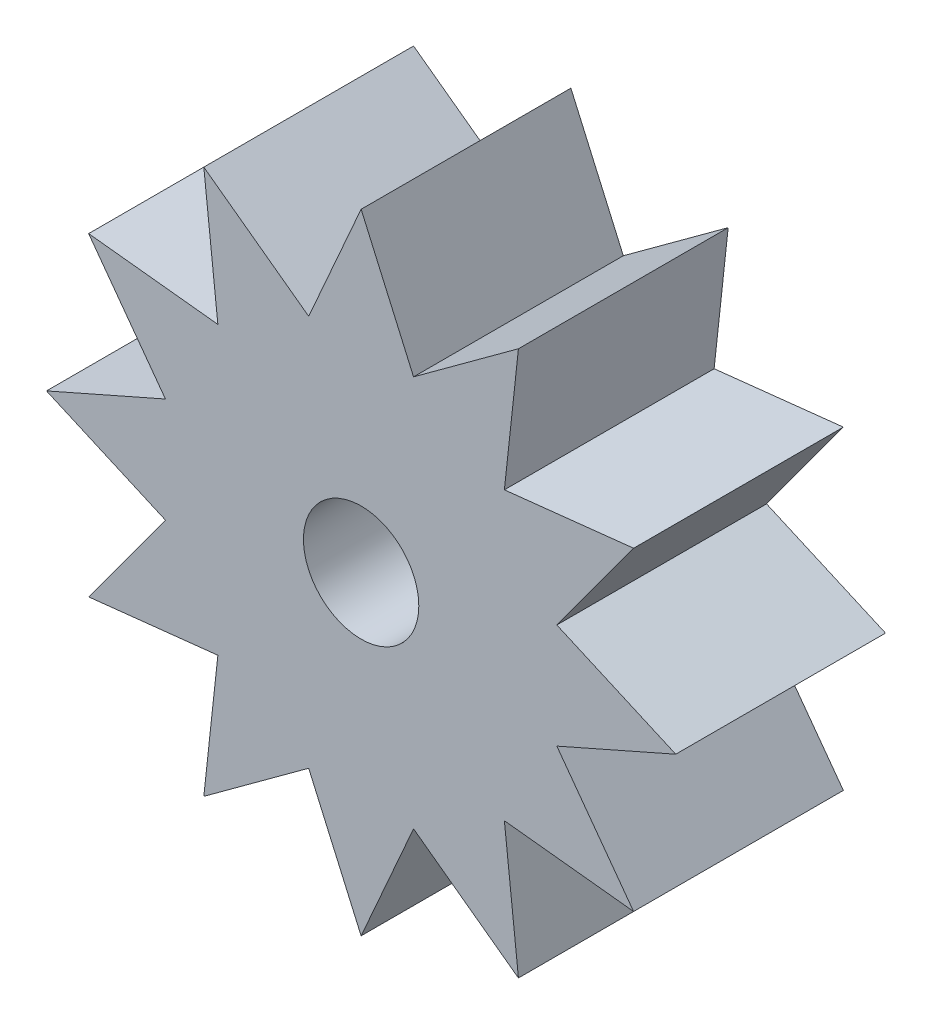
ISO-10303-21;
HEADER;
FILE_DESCRIPTION(('STEP AP214'),'2;1');
FILE_NAME('part.step','',(''),(''),'','','');
FILE_SCHEMA(('AUTOMOTIVE_DESIGN { 1 0 10303 214 1 1 1 1 }'));
ENDSEC;
DATA;
#1=APPLICATION_CONTEXT('core data for automotive mechanical design processes');
#2=APPLICATION_PROTOCOL_DEFINITION('international standard','automotive_design',2000,#1);
#3=PRODUCT_CONTEXT('',#1,'mechanical');
#4=PRODUCT('Part','Part','',(#3));
#5=PRODUCT_RELATED_PRODUCT_CATEGORY('part','',(#4));
#6=PRODUCT_DEFINITION_FORMATION('','',#4);
#7=PRODUCT_DEFINITION_CONTEXT('part definition',#1,'design');
#8=PRODUCT_DEFINITION('design','',#6,#7);
#9=PRODUCT_DEFINITION_SHAPE('','',#8);
#10=(LENGTH_UNIT() NAMED_UNIT(*) SI_UNIT(.MILLI.,.METRE.));
#11=(NAMED_UNIT(*) PLANE_ANGLE_UNIT() SI_UNIT($,.RADIAN.));
#12=(NAMED_UNIT(*) SI_UNIT($,.STERADIAN.) SOLID_ANGLE_UNIT());
#13=UNCERTAINTY_MEASURE_WITH_UNIT(LENGTH_MEASURE(1.E-05),#10,'distance_accuracy_value','');
#14=(GEOMETRIC_REPRESENTATION_CONTEXT(3) GLOBAL_UNCERTAINTY_ASSIGNED_CONTEXT((#13)) GLOBAL_UNIT_ASSIGNED_CONTEXT((#10,
#11,#12)) REPRESENTATION_CONTEXT('',''));
#15=CARTESIAN_POINT('',(0.,0.,0.));
#16=DIRECTION('',(0.,0.,1.));
#17=DIRECTION('',(1.,0.,0.));
#18=AXIS2_PLACEMENT_3D('',#15,#16,#17);
#19=CARTESIAN_POINT('',(-3.57470332079229,-4.88313554719487,10.));
#20=DIRECTION('',(-0.590690494568871,-0.806898221355074,0.));
#21=DIRECTION('',(0.806898221355074,-0.590690494568871,0.));
#22=AXIS2_PLACEMENT_3D('',#19,#20,#21);
#23=PLANE('',#22);
#24=DIRECTION('',(-0.806898221355074,0.590690494568871,0.));
#25=VECTOR('',#24,1.);
#26=CARTESIAN_POINT('',(-3.57470332079229,-4.88313554719487,0.));
#27=LINE('',#26,#25);
#28=CARTESIAN_POINT('',(7.50000000000001,-12.9903810567666,0.));
#29=VERTEX_POINT('',#28);
#30=CARTESIAN_POINT('',(2.5,-9.3301270189222,0.));
#31=VERTEX_POINT('',#30);
#32=EDGE_CURVE('E228',#29,#31,#27,.T.);
#33=ORIENTED_EDGE('',*,*,#32,.F.);
#34=DIRECTION('',(0.,0.,-1.));
#35=VECTOR('',#34,1.);
#36=CARTESIAN_POINT('',(7.50000000000001,-12.9903810567666,10.));
#37=LINE('',#36,#35);
#38=CARTESIAN_POINT('',(7.50000000000001,-12.9903810567666,10.));
#39=VERTEX_POINT('',#38);
#40=EDGE_CURVE('E11',#39,#29,#37,.T.);
#41=ORIENTED_EDGE('',*,*,#40,.F.);
#42=DIRECTION('',(-0.806898221355074,0.590690494568871,0.));
#43=VECTOR('',#42,1.);
#44=CARTESIAN_POINT('',(-3.57470332079229,-4.88313554719487,10.));
#45=LINE('',#44,#43);
#46=CARTESIAN_POINT('',(2.5,-9.3301270189222,10.));
#47=VERTEX_POINT('',#46);
#48=EDGE_CURVE('E361',#39,#47,#45,.T.);
#49=ORIENTED_EDGE('',*,*,#48,.T.);
#50=DIRECTION('',(0.,0.,-1.));
#51=VECTOR('',#50,1.);
#52=CARTESIAN_POINT('',(2.5,-9.3301270189222,10.));
#53=LINE('',#52,#51);
#54=EDGE_CURVE('E134',#47,#31,#53,.T.);
#55=ORIENTED_EDGE('',*,*,#54,.T.);
#56=EDGE_LOOP('',(#33,#41,#49,#55));
#57=FACE_BOUND('',#56,.T.);
#58=ADVANCED_FACE('F35',(#57),#23,.T.);
#59=CARTESIAN_POINT('',(6.01627109438972,0.654216113201287,10.));
#60=DIRECTION('',(-0.994139605246409,-0.108103863393101,0.));
#61=DIRECTION('',(0.108103863393101,-0.994139605246409,0.));
#62=AXIS2_PLACEMENT_3D('',#59,#60,#61);
#63=PLANE('',#62);
#64=DIRECTION('',(-0.108103863393101,0.994139605246409,0.));
#65=VECTOR('',#64,1.);
#66=CARTESIAN_POINT('',(6.01627109438972,0.654216113201287,0.));
#67=LINE('',#66,#65);
#68=CARTESIAN_POINT('',(6.8301270189222,-6.83012701892219,0.));
#69=VERTEX_POINT('',#68);
#70=EDGE_CURVE('E231',#29,#69,#67,.T.);
#71=ORIENTED_EDGE('',*,*,#70,.T.);
#72=DIRECTION('',(0.,0.,-1.));
#73=VECTOR('',#72,1.);
#74=CARTESIAN_POINT('',(6.8301270189222,-6.83012701892219,10.));
#75=LINE('',#74,#73);
#76=CARTESIAN_POINT('',(6.8301270189222,-6.83012701892219,10.));
#77=VERTEX_POINT('',#76);
#78=EDGE_CURVE('E44',#77,#69,#75,.T.);
#79=ORIENTED_EDGE('',*,*,#78,.F.);
#80=DIRECTION('',(-0.108103863393101,0.994139605246409,0.));
#81=VECTOR('',#80,1.);
#82=CARTESIAN_POINT('',(6.01627109438972,0.654216113201287,10.));
#83=LINE('',#82,#81);
#84=EDGE_CURVE('E359',#39,#77,#83,.T.);
#85=ORIENTED_EDGE('',*,*,#84,.F.);
#86=ORIENTED_EDGE('',*,*,#40,.T.);
#87=EDGE_LOOP('',(#71,#79,#85,#86));
#88=FACE_BOUND('',#87,.T.);
#89=ADVANCED_FACE('F344',(#88),#63,.F.);
#90=CARTESIAN_POINT('',(-0.654216113201279,-6.01627109438972,10.));
#91=DIRECTION('',(-0.1081038633931,-0.994139605246409,0.));
#92=DIRECTION('',(0.994139605246409,-0.1081038633931,0.));
#93=AXIS2_PLACEMENT_3D('',#90,#91,#92);
#94=PLANE('',#93);
#95=DIRECTION('',(-0.994139605246409,0.1081038633931,0.));
#96=VECTOR('',#95,1.);
#97=CARTESIAN_POINT('',(-0.654216113201279,-6.01627109438972,0.));
#98=LINE('',#97,#96);
#99=CARTESIAN_POINT('',(12.9903810567666,-7.49999999999999,0.));
#100=VERTEX_POINT('',#99);
#101=EDGE_CURVE('E234',#100,#69,#98,.T.);
#102=ORIENTED_EDGE('',*,*,#101,.F.);
#103=DIRECTION('',(0.,0.,-1.));
#104=VECTOR('',#103,1.);
#105=CARTESIAN_POINT('',(12.9903810567666,-7.49999999999999,10.));
#106=LINE('',#105,#104);
#107=CARTESIAN_POINT('',(12.9903810567666,-7.49999999999999,10.));
#108=VERTEX_POINT('',#107);
#109=EDGE_CURVE('E334',#108,#100,#106,.T.);
#110=ORIENTED_EDGE('',*,*,#109,.F.);
#111=DIRECTION('',(-0.994139605246409,0.1081038633931,0.));
#112=VECTOR('',#111,1.);
#113=CARTESIAN_POINT('',(-0.654216113201279,-6.01627109438972,10.));
#114=LINE('',#113,#112);
#115=EDGE_CURVE('E341',#108,#77,#114,.T.);
#116=ORIENTED_EDGE('',*,*,#115,.T.);
#117=ORIENTED_EDGE('',*,*,#78,.T.);
#118=EDGE_LOOP('',(#102,#110,#116,#117));
#119=FACE_BOUND('',#118,.T.);
#120=ADVANCED_FACE('F339',(#119),#94,.T.);
#121=CARTESIAN_POINT('',(4.88313554719486,3.57470332079229,10.));
#122=DIRECTION('',(-0.806898221355073,-0.590690494568873,0.));
#123=DIRECTION('',(0.590690494568873,-0.806898221355073,0.));
#124=AXIS2_PLACEMENT_3D('',#121,#122,#123);
#125=PLANE('',#124);
#126=DIRECTION('',(-0.590690494568873,0.806898221355073,0.));
#127=VECTOR('',#126,1.);
#128=CARTESIAN_POINT('',(4.88313554719486,3.57470332079229,0.));
#129=LINE('',#128,#127);
#130=CARTESIAN_POINT('',(9.3301270189222,-2.49999999999999,0.));
#131=VERTEX_POINT('',#130);
#132=EDGE_CURVE('E237',#100,#131,#129,.T.);
#133=ORIENTED_EDGE('',*,*,#132,.T.);
#134=DIRECTION('',(0.,0.,-1.));
#135=VECTOR('',#134,1.);
#136=CARTESIAN_POINT('',(9.3301270189222,-2.49999999999999,10.));
#137=LINE('',#136,#135);
#138=CARTESIAN_POINT('',(9.3301270189222,-2.49999999999999,10.));
#139=VERTEX_POINT('',#138);
#140=EDGE_CURVE('E332',#139,#131,#137,.T.);
#141=ORIENTED_EDGE('',*,*,#140,.F.);
#142=DIRECTION('',(-0.590690494568873,0.806898221355073,0.));
#143=VECTOR('',#142,1.);
#144=CARTESIAN_POINT('',(4.88313554719486,3.57470332079229,10.));
#145=LINE('',#144,#143);
#146=EDGE_CURVE('E355',#108,#139,#145,.T.);
#147=ORIENTED_EDGE('',*,*,#146,.F.);
#148=ORIENTED_EDGE('',*,*,#109,.T.);
#149=EDGE_LOOP('',(#133,#141,#147,#148));
#150=FACE_BOUND('',#149,.T.);
#151=ADVANCED_FACE('F352',(#150),#125,.F.);
#152=CARTESIAN_POINT('',(2.44156777359742,-5.53735166039614,10.));
#153=DIRECTION('',(0.403449110677536,-0.915002084748174,0.));
#154=DIRECTION('',(0.915002084748174,0.403449110677536,0.));
#155=AXIS2_PLACEMENT_3D('',#152,#153,#154);
#156=PLANE('',#155);
#157=DIRECTION('',(-0.915002084748174,-0.403449110677536,0.));
#158=VECTOR('',#157,1.);
#159=CARTESIAN_POINT('',(2.44156777359742,-5.53735166039614,0.));
#160=LINE('',#159,#158);
#161=CARTESIAN_POINT('',(15.,0.,0.));
#162=VERTEX_POINT('',#161);
#163=EDGE_CURVE('E240',#162,#131,#160,.T.);
#164=ORIENTED_EDGE('',*,*,#163,.F.);
#165=DIRECTION('',(0.,0.,-1.));
#166=VECTOR('',#165,1.);
#167=CARTESIAN_POINT('',(15.,0.,10.));
#168=LINE('',#167,#166);
#169=CARTESIAN_POINT('',(15.,0.,10.));
#170=VERTEX_POINT('',#169);
#171=EDGE_CURVE('E330',#170,#162,#168,.T.);
#172=ORIENTED_EDGE('',*,*,#171,.F.);
#173=DIRECTION('',(-0.915002084748174,-0.403449110677536,0.));
#174=VECTOR('',#173,1.);
#175=CARTESIAN_POINT('',(2.44156777359742,-5.53735166039614,10.));
#176=LINE('',#175,#174);
#177=EDGE_CURVE('E357',#170,#139,#176,.T.);
#178=ORIENTED_EDGE('',*,*,#177,.T.);
#179=ORIENTED_EDGE('',*,*,#140,.T.);
#180=EDGE_LOOP('',(#164,#172,#178,#179));
#181=FACE_BOUND('',#180,.T.);
#182=ADVANCED_FACE('F433',(#181),#156,.T.);
#183=CARTESIAN_POINT('',(2.44156777359743,5.53735166039615,10.));
#184=DIRECTION('',(-0.403449110677537,-0.915002084748174,0.));
#185=DIRECTION('',(0.915002084748174,-0.403449110677537,0.));
#186=AXIS2_PLACEMENT_3D('',#183,#184,#185);
#187=PLANE('',#186);
#188=DIRECTION('',(-0.915002084748174,0.403449110677537,0.));
#189=VECTOR('',#188,1.);
#190=CARTESIAN_POINT('',(2.44156777359743,5.53735166039615,0.));
#191=LINE('',#190,#189);
#192=CARTESIAN_POINT('',(9.33012701892219,2.5,0.));
#193=VERTEX_POINT('',#192);
#194=EDGE_CURVE('E243',#162,#193,#191,.T.);
#195=ORIENTED_EDGE('',*,*,#194,.T.);
#196=DIRECTION('',(0.,0.,-1.));
#197=VECTOR('',#196,1.);
#198=CARTESIAN_POINT('',(9.33012701892219,2.5,10.));
#199=LINE('',#198,#197);
#200=CARTESIAN_POINT('',(9.33012701892219,2.5,10.));
#201=VERTEX_POINT('',#200);
#202=EDGE_CURVE('E328',#201,#193,#199,.T.);
#203=ORIENTED_EDGE('',*,*,#202,.F.);
#204=DIRECTION('',(-0.915002084748174,0.403449110677537,0.));
#205=VECTOR('',#204,1.);
#206=CARTESIAN_POINT('',(2.44156777359743,5.53735166039615,10.));
#207=LINE('',#206,#205);
#208=EDGE_CURVE('E366',#170,#201,#207,.T.);
#209=ORIENTED_EDGE('',*,*,#208,.F.);
#210=ORIENTED_EDGE('',*,*,#171,.T.);
#211=EDGE_LOOP('',(#195,#203,#209,#210));
#212=FACE_BOUND('',#211,.T.);
#213=ADVANCED_FACE('F436',(#212),#187,.F.);
#214=CARTESIAN_POINT('',(4.88313554719486,-3.57470332079229,10.));
#215=DIRECTION('',(0.806898221355074,-0.590690494568872,0.));
#216=DIRECTION('',(0.590690494568872,0.806898221355074,0.));
#217=AXIS2_PLACEMENT_3D('',#214,#215,#216);
#218=PLANE('',#217);
#219=DIRECTION('',(-0.590690494568872,-0.806898221355074,0.));
#220=VECTOR('',#219,1.);
#221=CARTESIAN_POINT('',(4.88313554719486,-3.57470332079229,0.));
#222=LINE('',#221,#220);
#223=CARTESIAN_POINT('',(12.9903810567666,7.50000000000001,0.));
#224=VERTEX_POINT('',#223);
#225=EDGE_CURVE('E246',#224,#193,#222,.T.);
#226=ORIENTED_EDGE('',*,*,#225,.F.);
#227=DIRECTION('',(0.,0.,-1.));
#228=VECTOR('',#227,1.);
#229=CARTESIAN_POINT('',(12.9903810567666,7.50000000000001,10.));
#230=LINE('',#229,#228);
#231=CARTESIAN_POINT('',(12.9903810567666,7.50000000000001,10.));
#232=VERTEX_POINT('',#231);
#233=EDGE_CURVE('E326',#232,#224,#230,.T.);
#234=ORIENTED_EDGE('',*,*,#233,.F.);
#235=DIRECTION('',(-0.590690494568872,-0.806898221355074,0.));
#236=VECTOR('',#235,1.);
#237=CARTESIAN_POINT('',(4.88313554719486,-3.57470332079229,10.));
#238=LINE('',#237,#236);
#239=EDGE_CURVE('E368',#232,#201,#238,.T.);
#240=ORIENTED_EDGE('',*,*,#239,.T.);
#241=ORIENTED_EDGE('',*,*,#202,.T.);
#242=EDGE_LOOP('',(#226,#234,#240,#241));
#243=FACE_BOUND('',#242,.T.);
#244=ADVANCED_FACE('F440',(#243),#218,.T.);
#245=CARTESIAN_POINT('',(-0.654216113201287,6.01627109438972,10.));
#246=DIRECTION('',(0.108103863393101,-0.994139605246409,0.));
#247=DIRECTION('',(0.994139605246409,0.108103863393101,0.));
#248=AXIS2_PLACEMENT_3D('',#245,#246,#247);
#249=PLANE('',#248);
#250=DIRECTION('',(-0.994139605246409,-0.108103863393101,0.));
#251=VECTOR('',#250,1.);
#252=CARTESIAN_POINT('',(-0.654216113201287,6.01627109438972,0.));
#253=LINE('',#252,#251);
#254=CARTESIAN_POINT('',(6.83012701892219,6.8301270189222,0.));
#255=VERTEX_POINT('',#254);
#256=EDGE_CURVE('E249',#224,#255,#253,.T.);
#257=ORIENTED_EDGE('',*,*,#256,.T.);
#258=DIRECTION('',(0.,0.,-1.));
#259=VECTOR('',#258,1.);
#260=CARTESIAN_POINT('',(6.83012701892219,6.8301270189222,10.));
#261=LINE('',#260,#259);
#262=CARTESIAN_POINT('',(6.83012701892219,6.8301270189222,10.));
#263=VERTEX_POINT('',#262);
#264=EDGE_CURVE('E324',#263,#255,#261,.T.);
#265=ORIENTED_EDGE('',*,*,#264,.F.);
#266=DIRECTION('',(-0.994139605246409,-0.108103863393101,0.));
#267=VECTOR('',#266,1.);
#268=CARTESIAN_POINT('',(-0.654216113201287,6.01627109438972,10.));
#269=LINE('',#268,#267);
#270=EDGE_CURVE('E371',#232,#263,#269,.T.);
#271=ORIENTED_EDGE('',*,*,#270,.F.);
#272=ORIENTED_EDGE('',*,*,#233,.T.);
#273=EDGE_LOOP('',(#257,#265,#271,#272));
#274=FACE_BOUND('',#273,.T.);
#275=ADVANCED_FACE('F444',(#274),#249,.F.);
#276=CARTESIAN_POINT('',(6.01627109438971,-0.654216113201285,10.));
#277=DIRECTION('',(0.994139605246409,-0.108103863393101,0.));
#278=DIRECTION('',(0.108103863393101,0.994139605246409,0.));
#279=AXIS2_PLACEMENT_3D('',#276,#277,#278);
#280=PLANE('',#279);
#281=DIRECTION('',(-0.108103863393101,-0.994139605246409,0.));
#282=VECTOR('',#281,1.);
#283=CARTESIAN_POINT('',(6.01627109438971,-0.654216113201285,0.));
#284=LINE('',#283,#282);
#285=CARTESIAN_POINT('',(7.5,12.9903810567666,0.));
#286=VERTEX_POINT('',#285);
#287=EDGE_CURVE('E252',#286,#255,#284,.T.);
#288=ORIENTED_EDGE('',*,*,#287,.F.);
#289=DIRECTION('',(0.,0.,-1.));
#290=VECTOR('',#289,1.);
#291=CARTESIAN_POINT('',(7.5,12.9903810567666,10.));
#292=LINE('',#291,#290);
#293=CARTESIAN_POINT('',(7.5,12.9903810567666,10.));
#294=VERTEX_POINT('',#293);
#295=EDGE_CURVE('E322',#294,#286,#292,.T.);
#296=ORIENTED_EDGE('',*,*,#295,.F.);
#297=DIRECTION('',(-0.108103863393101,-0.994139605246409,0.));
#298=VECTOR('',#297,1.);
#299=CARTESIAN_POINT('',(6.01627109438971,-0.654216113201285,10.));
#300=LINE('',#299,#298);
#301=EDGE_CURVE('E373',#294,#263,#300,.T.);
#302=ORIENTED_EDGE('',*,*,#301,.T.);
#303=ORIENTED_EDGE('',*,*,#264,.T.);
#304=EDGE_LOOP('',(#288,#296,#302,#303));
#305=FACE_BOUND('',#304,.T.);
#306=ADVANCED_FACE('F448',(#305),#280,.T.);
#307=CARTESIAN_POINT('',(-3.57470332079229,4.88313554719487,10.));
#308=DIRECTION('',(0.590690494568872,-0.806898221355074,0.));
#309=DIRECTION('',(0.806898221355073,0.590690494568872,0.));
#310=AXIS2_PLACEMENT_3D('',#307,#308,#309);
#311=PLANE('',#310);
#312=DIRECTION('',(-0.806898221355074,-0.590690494568872,0.));
#313=VECTOR('',#312,1.);
#314=CARTESIAN_POINT('',(-3.57470332079229,4.88313554719487,0.));
#315=LINE('',#314,#313);
#316=CARTESIAN_POINT('',(2.49999999999999,9.3301270189222,0.));
#317=VERTEX_POINT('',#316);
#318=EDGE_CURVE('E255',#286,#317,#315,.T.);
#319=ORIENTED_EDGE('',*,*,#318,.T.);
#320=DIRECTION('',(0.,0.,-1.));
#321=VECTOR('',#320,1.);
#322=CARTESIAN_POINT('',(2.49999999999999,9.3301270189222,10.));
#323=LINE('',#322,#321);
#324=CARTESIAN_POINT('',(2.49999999999999,9.3301270189222,10.));
#325=VERTEX_POINT('',#324);
#326=EDGE_CURVE('E320',#325,#317,#323,.T.);
#327=ORIENTED_EDGE('',*,*,#326,.F.);
#328=DIRECTION('',(-0.806898221355074,-0.590690494568872,0.));
#329=VECTOR('',#328,1.);
#330=CARTESIAN_POINT('',(-3.57470332079229,4.88313554719487,10.));
#331=LINE('',#330,#329);
#332=EDGE_CURVE('E376',#294,#325,#331,.T.);
#333=ORIENTED_EDGE('',*,*,#332,.F.);
#334=ORIENTED_EDGE('',*,*,#295,.T.);
#335=EDGE_LOOP('',(#319,#327,#333,#334));
#336=FACE_BOUND('',#335,.T.);
#337=ADVANCED_FACE('F452',(#336),#311,.F.);
#338=CARTESIAN_POINT('',(5.53735166039614,2.44156777359743,10.));
#339=DIRECTION('',(0.915002084748174,0.403449110677537,0.));
#340=DIRECTION('',(-0.403449110677537,0.915002084748174,0.));
#341=AXIS2_PLACEMENT_3D('',#338,#339,#340);
#342=PLANE('',#341);
#343=DIRECTION('',(0.403449110677537,-0.915002084748174,0.));
#344=VECTOR('',#343,1.);
#345=CARTESIAN_POINT('',(5.53735166039614,2.44156777359743,0.));
#346=LINE('',#345,#344);
#347=CARTESIAN_POINT('',(0.,15.,0.));
#348=VERTEX_POINT('',#347);
#349=EDGE_CURVE('E258',#348,#317,#346,.T.);
#350=ORIENTED_EDGE('',*,*,#349,.F.);
#351=DIRECTION('',(0.,0.,-1.));
#352=VECTOR('',#351,1.);
#353=CARTESIAN_POINT('',(0.,15.,10.));
#354=LINE('',#353,#352);
#355=CARTESIAN_POINT('',(0.,15.,10.));
#356=VERTEX_POINT('',#355);
#357=EDGE_CURVE('E318',#356,#348,#354,.T.);
#358=ORIENTED_EDGE('',*,*,#357,.F.);
#359=DIRECTION('',(0.403449110677537,-0.915002084748174,0.));
#360=VECTOR('',#359,1.);
#361=CARTESIAN_POINT('',(5.53735166039614,2.44156777359743,10.));
#362=LINE('',#361,#360);
#363=EDGE_CURVE('E378',#356,#325,#362,.T.);
#364=ORIENTED_EDGE('',*,*,#363,.T.);
#365=ORIENTED_EDGE('',*,*,#326,.T.);
#366=EDGE_LOOP('',(#350,#358,#364,#365));
#367=FACE_BOUND('',#366,.T.);
#368=ADVANCED_FACE('F456',(#367),#342,.T.);
#369=CARTESIAN_POINT('',(-5.53735166039615,2.44156777359743,10.));
#370=DIRECTION('',(0.915002084748174,-0.403449110677537,0.));
#371=DIRECTION('',(0.403449110677537,0.915002084748174,0.));
#372=AXIS2_PLACEMENT_3D('',#369,#370,#371);
#373=PLANE('',#372);
#374=DIRECTION('',(-0.403449110677537,-0.915002084748174,0.));
#375=VECTOR('',#374,1.);
#376=CARTESIAN_POINT('',(-5.53735166039615,2.44156777359743,0.));
#377=LINE('',#376,#375);
#378=CARTESIAN_POINT('',(-2.5,9.33012701892219,0.));
#379=VERTEX_POINT('',#378);
#380=EDGE_CURVE('E261',#348,#379,#377,.T.);
#381=ORIENTED_EDGE('',*,*,#380,.T.);
#382=DIRECTION('',(0.,0.,-1.));
#383=VECTOR('',#382,1.);
#384=CARTESIAN_POINT('',(-2.5,9.33012701892219,10.));
#385=LINE('',#384,#383);
#386=CARTESIAN_POINT('',(-2.5,9.33012701892219,10.));
#387=VERTEX_POINT('',#386);
#388=EDGE_CURVE('E316',#387,#379,#385,.T.);
#389=ORIENTED_EDGE('',*,*,#388,.F.);
#390=DIRECTION('',(-0.403449110677537,-0.915002084748174,0.));
#391=VECTOR('',#390,1.);
#392=CARTESIAN_POINT('',(-5.53735166039615,2.44156777359743,10.));
#393=LINE('',#392,#391);
#394=EDGE_CURVE('E381',#356,#387,#393,.T.);
#395=ORIENTED_EDGE('',*,*,#394,.F.);
#396=ORIENTED_EDGE('',*,*,#357,.T.);
#397=EDGE_LOOP('',(#381,#389,#395,#396));
#398=FACE_BOUND('',#397,.T.);
#399=ADVANCED_FACE('F460',(#398),#373,.F.);
#400=CARTESIAN_POINT('',(3.57470332079229,4.88313554719486,10.));
#401=DIRECTION('',(0.590690494568872,0.806898221355074,0.));
#402=DIRECTION('',(-0.806898221355074,0.590690494568872,0.));
#403=AXIS2_PLACEMENT_3D('',#400,#401,#402);
#404=PLANE('',#403);
#405=DIRECTION('',(0.806898221355074,-0.590690494568872,0.));
#406=VECTOR('',#405,1.);
#407=CARTESIAN_POINT('',(3.57470332079229,4.88313554719486,0.));
#408=LINE('',#407,#406);
#409=CARTESIAN_POINT('',(-7.50000000000001,12.9903810567666,0.));
#410=VERTEX_POINT('',#409);
#411=EDGE_CURVE('E264',#410,#379,#408,.T.);
#412=ORIENTED_EDGE('',*,*,#411,.F.);
#413=DIRECTION('',(0.,0.,-1.));
#414=VECTOR('',#413,1.);
#415=CARTESIAN_POINT('',(-7.50000000000001,12.9903810567666,10.));
#416=LINE('',#415,#414);
#417=CARTESIAN_POINT('',(-7.50000000000001,12.9903810567666,10.));
#418=VERTEX_POINT('',#417);
#419=EDGE_CURVE('E314',#418,#410,#416,.T.);
#420=ORIENTED_EDGE('',*,*,#419,.F.);
#421=DIRECTION('',(0.806898221355074,-0.590690494568872,0.));
#422=VECTOR('',#421,1.);
#423=CARTESIAN_POINT('',(3.57470332079229,4.88313554719486,10.));
#424=LINE('',#423,#422);
#425=EDGE_CURVE('E383',#418,#387,#424,.T.);
#426=ORIENTED_EDGE('',*,*,#425,.T.);
#427=ORIENTED_EDGE('',*,*,#388,.T.);
#428=EDGE_LOOP('',(#412,#420,#426,#427));
#429=FACE_BOUND('',#428,.T.);
#430=ADVANCED_FACE('F464',(#429),#404,.T.);
#431=CARTESIAN_POINT('',(-6.01627109438972,-0.654216113201286,10.));
#432=DIRECTION('',(0.994139605246409,0.108103863393101,0.));
#433=DIRECTION('',(-0.108103863393101,0.994139605246409,0.));
#434=AXIS2_PLACEMENT_3D('',#431,#432,#433);
#435=PLANE('',#434);
#436=DIRECTION('',(0.108103863393101,-0.994139605246409,0.));
#437=VECTOR('',#436,1.);
#438=CARTESIAN_POINT('',(-6.01627109438972,-0.654216113201286,0.));
#439=LINE('',#438,#437);
#440=CARTESIAN_POINT('',(-6.8301270189222,6.83012701892219,0.));
#441=VERTEX_POINT('',#440);
#442=EDGE_CURVE('E267',#410,#441,#439,.T.);
#443=ORIENTED_EDGE('',*,*,#442,.T.);
#444=DIRECTION('',(0.,0.,-1.));
#445=VECTOR('',#444,1.);
#446=CARTESIAN_POINT('',(-6.8301270189222,6.83012701892219,10.));
#447=LINE('',#446,#445);
#448=CARTESIAN_POINT('',(-6.8301270189222,6.83012701892219,10.));
#449=VERTEX_POINT('',#448);
#450=EDGE_CURVE('E312',#449,#441,#447,.T.);
#451=ORIENTED_EDGE('',*,*,#450,.F.);
#452=DIRECTION('',(0.108103863393101,-0.994139605246409,0.));
#453=VECTOR('',#452,1.);
#454=CARTESIAN_POINT('',(-6.01627109438972,-0.654216113201286,10.));
#455=LINE('',#454,#453);
#456=EDGE_CURVE('E386',#418,#449,#455,.T.);
#457=ORIENTED_EDGE('',*,*,#456,.F.);
#458=ORIENTED_EDGE('',*,*,#419,.T.);
#459=EDGE_LOOP('',(#443,#451,#457,#458));
#460=FACE_BOUND('',#459,.T.);
#461=ADVANCED_FACE('F468',(#460),#435,.F.);
#462=CARTESIAN_POINT('',(0.654216113201285,6.01627109438971,10.));
#463=DIRECTION('',(0.108103863393101,0.994139605246409,0.));
#464=DIRECTION('',(-0.994139605246409,0.108103863393101,0.));
#465=AXIS2_PLACEMENT_3D('',#462,#463,#464);
#466=PLANE('',#465);
#467=DIRECTION('',(0.994139605246409,-0.108103863393101,0.));
#468=VECTOR('',#467,1.);
#469=CARTESIAN_POINT('',(0.654216113201285,6.01627109438971,0.));
#470=LINE('',#469,#468);
#471=CARTESIAN_POINT('',(-12.9903810567666,7.5,0.));
#472=VERTEX_POINT('',#471);
#473=EDGE_CURVE('E270',#472,#441,#470,.T.);
#474=ORIENTED_EDGE('',*,*,#473,.F.);
#475=DIRECTION('',(0.,0.,-1.));
#476=VECTOR('',#475,1.);
#477=CARTESIAN_POINT('',(-12.9903810567666,7.5,10.));
#478=LINE('',#477,#476);
#479=CARTESIAN_POINT('',(-12.9903810567666,7.5,10.));
#480=VERTEX_POINT('',#479);
#481=EDGE_CURVE('E310',#480,#472,#478,.T.);
#482=ORIENTED_EDGE('',*,*,#481,.F.);
#483=DIRECTION('',(0.994139605246409,-0.108103863393101,0.));
#484=VECTOR('',#483,1.);
#485=CARTESIAN_POINT('',(0.654216113201285,6.01627109438971,10.));
#486=LINE('',#485,#484);
#487=EDGE_CURVE('E388',#480,#449,#486,.T.);
#488=ORIENTED_EDGE('',*,*,#487,.T.);
#489=ORIENTED_EDGE('',*,*,#450,.T.);
#490=EDGE_LOOP('',(#474,#482,#488,#489));
#491=FACE_BOUND('',#490,.T.);
#492=ADVANCED_FACE('F472',(#491),#466,.T.);
#493=CARTESIAN_POINT('',(-4.88313554719486,-3.57470332079229,10.));
#494=DIRECTION('',(0.806898221355074,0.590690494568872,0.));
#495=DIRECTION('',(-0.590690494568872,0.806898221355073,0.));
#496=AXIS2_PLACEMENT_3D('',#493,#494,#495);
#497=PLANE('',#496);
#498=DIRECTION('',(0.590690494568872,-0.806898221355074,0.));
#499=VECTOR('',#498,1.);
#500=CARTESIAN_POINT('',(-4.88313554719486,-3.57470332079229,0.));
#501=LINE('',#500,#499);
#502=CARTESIAN_POINT('',(-9.3301270189222,2.5,0.));
#503=VERTEX_POINT('',#502);
#504=EDGE_CURVE('E273',#472,#503,#501,.T.);
#505=ORIENTED_EDGE('',*,*,#504,.T.);
#506=DIRECTION('',(0.,0.,-1.));
#507=VECTOR('',#506,1.);
#508=CARTESIAN_POINT('',(-9.3301270189222,2.5,10.));
#509=LINE('',#508,#507);
#510=CARTESIAN_POINT('',(-9.3301270189222,2.5,10.));
#511=VERTEX_POINT('',#510);
#512=EDGE_CURVE('E308',#511,#503,#509,.T.);
#513=ORIENTED_EDGE('',*,*,#512,.F.);
#514=DIRECTION('',(0.590690494568872,-0.806898221355074,0.));
#515=VECTOR('',#514,1.);
#516=CARTESIAN_POINT('',(-4.88313554719486,-3.57470332079229,10.));
#517=LINE('',#516,#515);
#518=EDGE_CURVE('E391',#480,#511,#517,.T.);
#519=ORIENTED_EDGE('',*,*,#518,.F.);
#520=ORIENTED_EDGE('',*,*,#481,.T.);
#521=EDGE_LOOP('',(#505,#513,#519,#520));
#522=FACE_BOUND('',#521,.T.);
#523=ADVANCED_FACE('F476',(#522),#497,.F.);
#524=CARTESIAN_POINT('',(-2.44156777359743,5.53735166039614,10.));
#525=DIRECTION('',(-0.403449110677537,0.915002084748174,0.));
#526=DIRECTION('',(-0.915002084748174,-0.403449110677537,0.));
#527=AXIS2_PLACEMENT_3D('',#524,#525,#526);
#528=PLANE('',#527);
#529=DIRECTION('',(0.915002084748174,0.403449110677537,0.));
#530=VECTOR('',#529,1.);
#531=CARTESIAN_POINT('',(-2.44156777359743,5.53735166039614,0.));
#532=LINE('',#531,#530);
#533=CARTESIAN_POINT('',(-15.,0.,0.));
#534=VERTEX_POINT('',#533);
#535=EDGE_CURVE('E276',#534,#503,#532,.T.);
#536=ORIENTED_EDGE('',*,*,#535,.F.);
#537=DIRECTION('',(0.,0.,-1.));
#538=VECTOR('',#537,1.);
#539=CARTESIAN_POINT('',(-15.,0.,10.));
#540=LINE('',#539,#538);
#541=CARTESIAN_POINT('',(-15.,0.,10.));
#542=VERTEX_POINT('',#541);
#543=EDGE_CURVE('E306',#542,#534,#540,.T.);
#544=ORIENTED_EDGE('',*,*,#543,.F.);
#545=DIRECTION('',(0.915002084748174,0.403449110677537,0.));
#546=VECTOR('',#545,1.);
#547=CARTESIAN_POINT('',(-2.44156777359743,5.53735166039614,10.));
#548=LINE('',#547,#546);
#549=EDGE_CURVE('E393',#542,#511,#548,.T.);
#550=ORIENTED_EDGE('',*,*,#549,.T.);
#551=ORIENTED_EDGE('',*,*,#512,.T.);
#552=EDGE_LOOP('',(#536,#544,#550,#551));
#553=FACE_BOUND('',#552,.T.);
#554=ADVANCED_FACE('F480',(#553),#528,.T.);
#555=CARTESIAN_POINT('',(-2.44156777359743,-5.53735166039615,10.));
#556=DIRECTION('',(0.403449110677537,0.915002084748174,0.));
#557=DIRECTION('',(-0.915002084748174,0.403449110677537,0.));
#558=AXIS2_PLACEMENT_3D('',#555,#556,#557);
#559=PLANE('',#558);
#560=DIRECTION('',(0.915002084748174,-0.403449110677537,0.));
#561=VECTOR('',#560,1.);
#562=CARTESIAN_POINT('',(-2.44156777359743,-5.53735166039615,0.));
#563=LINE('',#562,#561);
#564=CARTESIAN_POINT('',(-9.3301270189222,-2.5,0.));
#565=VERTEX_POINT('',#564);
#566=EDGE_CURVE('E279',#534,#565,#563,.T.);
#567=ORIENTED_EDGE('',*,*,#566,.T.);
#568=DIRECTION('',(0.,0.,-1.));
#569=VECTOR('',#568,1.);
#570=CARTESIAN_POINT('',(-9.3301270189222,-2.5,10.));
#571=LINE('',#570,#569);
#572=CARTESIAN_POINT('',(-9.3301270189222,-2.5,10.));
#573=VERTEX_POINT('',#572);
#574=EDGE_CURVE('E304',#573,#565,#571,.T.);
#575=ORIENTED_EDGE('',*,*,#574,.F.);
#576=DIRECTION('',(0.915002084748174,-0.403449110677537,0.));
#577=VECTOR('',#576,1.);
#578=CARTESIAN_POINT('',(-2.44156777359743,-5.53735166039615,10.));
#579=LINE('',#578,#577);
#580=EDGE_CURVE('E396',#542,#573,#579,.T.);
#581=ORIENTED_EDGE('',*,*,#580,.F.);
#582=ORIENTED_EDGE('',*,*,#543,.T.);
#583=EDGE_LOOP('',(#567,#575,#581,#582));
#584=FACE_BOUND('',#583,.T.);
#585=ADVANCED_FACE('F484',(#584),#559,.F.);
#586=CARTESIAN_POINT('',(-4.88313554719486,3.57470332079229,10.));
#587=DIRECTION('',(-0.806898221355074,0.590690494568872,0.));
#588=DIRECTION('',(-0.590690494568872,-0.806898221355074,0.));
#589=AXIS2_PLACEMENT_3D('',#586,#587,#588);
#590=PLANE('',#589);
#591=DIRECTION('',(0.590690494568872,0.806898221355074,0.));
#592=VECTOR('',#591,1.);
#593=CARTESIAN_POINT('',(-4.88313554719486,3.57470332079229,0.));
#594=LINE('',#593,#592);
#595=CARTESIAN_POINT('',(-12.9903810567666,-7.5,0.));
#596=VERTEX_POINT('',#595);
#597=EDGE_CURVE('E282',#596,#565,#594,.T.);
#598=ORIENTED_EDGE('',*,*,#597,.F.);
#599=DIRECTION('',(0.,0.,-1.));
#600=VECTOR('',#599,1.);
#601=CARTESIAN_POINT('',(-12.9903810567666,-7.5,10.));
#602=LINE('',#601,#600);
#603=CARTESIAN_POINT('',(-12.9903810567666,-7.5,10.));
#604=VERTEX_POINT('',#603);
#605=EDGE_CURVE('E302',#604,#596,#602,.T.);
#606=ORIENTED_EDGE('',*,*,#605,.F.);
#607=DIRECTION('',(0.590690494568872,0.806898221355074,0.));
#608=VECTOR('',#607,1.);
#609=CARTESIAN_POINT('',(-4.88313554719486,3.57470332079229,10.));
#610=LINE('',#609,#608);
#611=EDGE_CURVE('E398',#604,#573,#610,.T.);
#612=ORIENTED_EDGE('',*,*,#611,.T.);
#613=ORIENTED_EDGE('',*,*,#574,.T.);
#614=EDGE_LOOP('',(#598,#606,#612,#613));
#615=FACE_BOUND('',#614,.T.);
#616=ADVANCED_FACE('F488',(#615),#590,.T.);
#617=CARTESIAN_POINT('',(0.654216113201284,-6.01627109438972,10.));
#618=DIRECTION('',(-0.1081038633931,0.994139605246409,0.));
#619=DIRECTION('',(-0.994139605246409,-0.1081038633931,0.));
#620=AXIS2_PLACEMENT_3D('',#617,#618,#619);
#621=PLANE('',#620);
#622=DIRECTION('',(0.994139605246409,0.1081038633931,0.));
#623=VECTOR('',#622,1.);
#624=CARTESIAN_POINT('',(0.654216113201284,-6.01627109438972,0.));
#625=LINE('',#624,#623);
#626=CARTESIAN_POINT('',(-6.83012701892219,-6.8301270189222,0.));
#627=VERTEX_POINT('',#626);
#628=EDGE_CURVE('E285',#596,#627,#625,.T.);
#629=ORIENTED_EDGE('',*,*,#628,.T.);
#630=DIRECTION('',(0.,0.,-1.));
#631=VECTOR('',#630,1.);
#632=CARTESIAN_POINT('',(-6.83012701892219,-6.8301270189222,10.));
#633=LINE('',#632,#631);
#634=CARTESIAN_POINT('',(-6.83012701892219,-6.8301270189222,10.));
#635=VERTEX_POINT('',#634);
#636=EDGE_CURVE('E300',#635,#627,#633,.T.);
#637=ORIENTED_EDGE('',*,*,#636,.F.);
#638=DIRECTION('',(0.994139605246409,0.1081038633931,0.));
#639=VECTOR('',#638,1.);
#640=CARTESIAN_POINT('',(0.654216113201284,-6.01627109438972,10.));
#641=LINE('',#640,#639);
#642=EDGE_CURVE('E401',#604,#635,#641,.T.);
#643=ORIENTED_EDGE('',*,*,#642,.F.);
#644=ORIENTED_EDGE('',*,*,#605,.T.);
#645=EDGE_LOOP('',(#629,#637,#643,#644));
#646=FACE_BOUND('',#645,.T.);
#647=ADVANCED_FACE('F492',(#646),#621,.F.);
#648=CARTESIAN_POINT('',(-6.01627109438972,0.654216113201286,10.));
#649=DIRECTION('',(-0.994139605246409,0.108103863393101,0.));
#650=DIRECTION('',(-0.108103863393101,-0.994139605246409,0.));
#651=AXIS2_PLACEMENT_3D('',#648,#649,#650);
#652=PLANE('',#651);
#653=DIRECTION('',(0.108103863393101,0.994139605246409,0.));
#654=VECTOR('',#653,1.);
#655=CARTESIAN_POINT('',(-6.01627109438972,0.654216113201286,0.));
#656=LINE('',#655,#654);
#657=CARTESIAN_POINT('',(-7.5,-12.9903810567666,0.));
#658=VERTEX_POINT('',#657);
#659=EDGE_CURVE('E288',#658,#627,#656,.T.);
#660=ORIENTED_EDGE('',*,*,#659,.F.);
#661=DIRECTION('',(0.,0.,-1.));
#662=VECTOR('',#661,1.);
#663=CARTESIAN_POINT('',(-7.5,-12.9903810567666,10.));
#664=LINE('',#663,#662);
#665=CARTESIAN_POINT('',(-7.5,-12.9903810567666,10.));
#666=VERTEX_POINT('',#665);
#667=EDGE_CURVE('E218',#666,#658,#664,.T.);
#668=ORIENTED_EDGE('',*,*,#667,.F.);
#669=DIRECTION('',(0.108103863393101,0.994139605246409,0.));
#670=VECTOR('',#669,1.);
#671=CARTESIAN_POINT('',(-6.01627109438972,0.654216113201286,10.));
#672=LINE('',#671,#670);
#673=EDGE_CURVE('E207',#666,#635,#672,.T.);
#674=ORIENTED_EDGE('',*,*,#673,.T.);
#675=ORIENTED_EDGE('',*,*,#636,.T.);
#676=EDGE_LOOP('',(#660,#668,#674,#675));
#677=FACE_BOUND('',#676,.T.);
#678=ADVANCED_FACE('F404',(#677),#652,.T.);
#679=CARTESIAN_POINT('',(3.57470332079229,-4.88313554719487,10.));
#680=DIRECTION('',(-0.590690494568872,0.806898221355074,0.));
#681=DIRECTION('',(-0.806898221355074,-0.590690494568872,0.));
#682=AXIS2_PLACEMENT_3D('',#679,#680,#681);
#683=PLANE('',#682);
#684=DIRECTION('',(0.806898221355074,0.590690494568872,0.));
#685=VECTOR('',#684,1.);
#686=CARTESIAN_POINT('',(3.57470332079229,-4.88313554719487,0.));
#687=LINE('',#686,#685);
#688=CARTESIAN_POINT('',(-2.5,-9.3301270189222,0.));
#689=VERTEX_POINT('',#688);
#690=EDGE_CURVE('E214',#658,#689,#687,.T.);
#691=ORIENTED_EDGE('',*,*,#690,.T.);
#692=DIRECTION('',(0.,0.,-1.));
#693=VECTOR('',#692,1.);
#694=CARTESIAN_POINT('',(-2.5,-9.3301270189222,10.));
#695=LINE('',#694,#693);
#696=CARTESIAN_POINT('',(-2.5,-9.3301270189222,10.));
#697=VERTEX_POINT('',#696);
#698=EDGE_CURVE('E211',#697,#689,#695,.T.);
#699=ORIENTED_EDGE('',*,*,#698,.F.);
#700=DIRECTION('',(0.806898221355074,0.590690494568872,0.));
#701=VECTOR('',#700,1.);
#702=CARTESIAN_POINT('',(3.57470332079229,-4.88313554719487,10.));
#703=LINE('',#702,#701);
#704=EDGE_CURVE('E201',#666,#697,#703,.T.);
#705=ORIENTED_EDGE('',*,*,#704,.F.);
#706=ORIENTED_EDGE('',*,*,#667,.T.);
#707=EDGE_LOOP('',(#691,#699,#705,#706));
#708=FACE_BOUND('',#707,.T.);
#709=ADVANCED_FACE('F212',(#708),#683,.F.);
#710=CARTESIAN_POINT('',(-5.53735166039615,-2.44156777359743,10.));
#711=DIRECTION('',(-0.915002084748174,-0.403449110677537,0.));
#712=DIRECTION('',(0.403449110677537,-0.915002084748174,0.));
#713=AXIS2_PLACEMENT_3D('',#710,#711,#712);
#714=PLANE('',#713);
#715=DIRECTION('',(-0.403449110677537,0.915002084748174,0.));
#716=VECTOR('',#715,1.);
#717=CARTESIAN_POINT('',(-5.53735166039615,-2.44156777359743,0.));
#718=LINE('',#717,#716);
#719=CARTESIAN_POINT('',(0.,-15.,0.));
#720=VERTEX_POINT('',#719);
#721=EDGE_CURVE('E292',#720,#689,#718,.T.);
#722=ORIENTED_EDGE('',*,*,#721,.F.);
#723=DIRECTION('',(0.,0.,-1.));
#724=VECTOR('',#723,1.);
#725=CARTESIAN_POINT('',(0.,-15.,10.));
#726=LINE('',#725,#724);
#727=CARTESIAN_POINT('',(0.,-15.,10.));
#728=VERTEX_POINT('',#727);
#729=EDGE_CURVE('E127',#728,#720,#726,.T.);
#730=ORIENTED_EDGE('',*,*,#729,.F.);
#731=DIRECTION('',(-0.403449110677537,0.915002084748174,0.));
#732=VECTOR('',#731,1.);
#733=CARTESIAN_POINT('',(-5.53735166039615,-2.44156777359743,10.));
#734=LINE('',#733,#732);
#735=EDGE_CURVE('E205',#728,#697,#734,.T.);
#736=ORIENTED_EDGE('',*,*,#735,.T.);
#737=ORIENTED_EDGE('',*,*,#698,.T.);
#738=EDGE_LOOP('',(#722,#730,#736,#737));
#739=FACE_BOUND('',#738,.T.);
#740=ADVANCED_FACE('F220',(#739),#714,.T.);
#741=CARTESIAN_POINT('',(0.,0.,10.));
#742=DIRECTION('',(0.,0.,-1.));
#743=DIRECTION('',(-1.,0.,0.));
#744=AXIS2_PLACEMENT_3D('',#741,#742,#743);
#745=CYLINDRICAL_SURFACE('',#744,2.75);
#746=CARTESIAN_POINT('',(0.,0.,10.));
#747=DIRECTION('',(0.,0.,1.));
#748=DIRECTION('',(1.,0.,0.));
#749=AXIS2_PLACEMENT_3D('',#746,#747,#748);
#750=CIRCLE('',#749,2.75);
#751=CARTESIAN_POINT('',(2.75,0.,10.));
#752=VERTEX_POINT('',#751);
#753=EDGE_CURVE('E296',#752,#752,#750,.T.);
#754=ORIENTED_EDGE('',*,*,#753,.T.);
#755=EDGE_LOOP('',(#754));
#756=FACE_BOUND('',#755,.T.);
#757=CARTESIAN_POINT('',(0.,0.,0.));
#758=DIRECTION('',(0.,0.,1.));
#759=DIRECTION('',(1.,0.,0.));
#760=AXIS2_PLACEMENT_3D('',#757,#758,#759);
#761=CIRCLE('',#760,2.75);
#762=CARTESIAN_POINT('',(2.75,0.,0.));
#763=VERTEX_POINT('',#762);
#764=EDGE_CURVE('E225',#763,#763,#761,.T.);
#765=ORIENTED_EDGE('',*,*,#764,.F.);
#766=EDGE_LOOP('',(#765));
#767=FACE_BOUND('',#766,.T.);
#768=ADVANCED_FACE('F37',(#756,#767),#745,.F.);
#769=CARTESIAN_POINT('',(5.53735166039615,-2.44156777359743,10.));
#770=DIRECTION('',(-0.915002084748174,0.403449110677537,0.));
#771=DIRECTION('',(-0.403449110677537,-0.915002084748174,0.));
#772=AXIS2_PLACEMENT_3D('',#769,#770,#771);
#773=PLANE('',#772);
#774=DIRECTION('',(0.403449110677537,0.915002084748174,0.));
#775=VECTOR('',#774,1.);
#776=CARTESIAN_POINT('',(5.53735166039615,-2.44156777359743,0.));
#777=LINE('',#776,#775);
#778=EDGE_CURVE('E294',#720,#31,#777,.T.);
#779=ORIENTED_EDGE('',*,*,#778,.T.);
#780=ORIENTED_EDGE('',*,*,#54,.F.);
#781=DIRECTION('',(0.403449110677537,0.915002084748174,0.));
#782=VECTOR('',#781,1.);
#783=CARTESIAN_POINT('',(5.53735166039615,-2.44156777359743,10.));
#784=LINE('',#783,#782);
#785=EDGE_CURVE('E52',#728,#47,#784,.T.);
#786=ORIENTED_EDGE('',*,*,#785,.F.);
#787=ORIENTED_EDGE('',*,*,#729,.T.);
#788=EDGE_LOOP('',(#779,#780,#786,#787));
#789=FACE_BOUND('',#788,.T.);
#790=ADVANCED_FACE('F407',(#789),#773,.F.);
#791=CARTESIAN_POINT('',(0.,0.,10.));
#792=DIRECTION('',(0.,0.,1.));
#793=DIRECTION('',(1.,0.,0.));
#794=AXIS2_PLACEMENT_3D('',#791,#792,#793);
#795=PLANE('',#794);
#796=ORIENTED_EDGE('',*,*,#753,.F.);
#797=EDGE_LOOP('',(#796));
#798=FACE_BOUND('',#797,.T.);
#799=ORIENTED_EDGE('',*,*,#48,.F.);
#800=ORIENTED_EDGE('',*,*,#84,.T.);
#801=ORIENTED_EDGE('',*,*,#115,.F.);
#802=ORIENTED_EDGE('',*,*,#146,.T.);
#803=ORIENTED_EDGE('',*,*,#177,.F.);
#804=ORIENTED_EDGE('',*,*,#208,.T.);
#805=ORIENTED_EDGE('',*,*,#239,.F.);
#806=ORIENTED_EDGE('',*,*,#270,.T.);
#807=ORIENTED_EDGE('',*,*,#301,.F.);
#808=ORIENTED_EDGE('',*,*,#332,.T.);
#809=ORIENTED_EDGE('',*,*,#363,.F.);
#810=ORIENTED_EDGE('',*,*,#394,.T.);
#811=ORIENTED_EDGE('',*,*,#425,.F.);
#812=ORIENTED_EDGE('',*,*,#456,.T.);
#813=ORIENTED_EDGE('',*,*,#487,.F.);
#814=ORIENTED_EDGE('',*,*,#518,.T.);
#815=ORIENTED_EDGE('',*,*,#549,.F.);
#816=ORIENTED_EDGE('',*,*,#580,.T.);
#817=ORIENTED_EDGE('',*,*,#611,.F.);
#818=ORIENTED_EDGE('',*,*,#642,.T.);
#819=ORIENTED_EDGE('',*,*,#673,.F.);
#820=ORIENTED_EDGE('',*,*,#704,.T.);
#821=ORIENTED_EDGE('',*,*,#735,.F.);
#822=ORIENTED_EDGE('',*,*,#785,.T.);
#823=EDGE_LOOP('',(#799,#800,#801,#802,#803,#804,#805,#806,#807,#808,#809,#810,#811,#812,#813,
#814,#815,#816,#817,#818,#819,#820,#821,#822));
#824=FACE_BOUND('',#823,.T.);
#825=ADVANCED_FACE('F203',(#798,#824),#795,.T.);
#826=CARTESIAN_POINT('',(0.,0.,0.));
#827=DIRECTION('',(0.,0.,1.));
#828=DIRECTION('',(1.,0.,0.));
#829=AXIS2_PLACEMENT_3D('',#826,#827,#828);
#830=PLANE('',#829);
#831=ORIENTED_EDGE('',*,*,#764,.T.);
#832=EDGE_LOOP('',(#831));
#833=FACE_BOUND('',#832,.T.);
#834=ORIENTED_EDGE('',*,*,#32,.T.);
#835=ORIENTED_EDGE('',*,*,#778,.F.);
#836=ORIENTED_EDGE('',*,*,#721,.T.);
#837=ORIENTED_EDGE('',*,*,#690,.F.);
#838=ORIENTED_EDGE('',*,*,#659,.T.);
#839=ORIENTED_EDGE('',*,*,#628,.F.);
#840=ORIENTED_EDGE('',*,*,#597,.T.);
#841=ORIENTED_EDGE('',*,*,#566,.F.);
#842=ORIENTED_EDGE('',*,*,#535,.T.);
#843=ORIENTED_EDGE('',*,*,#504,.F.);
#844=ORIENTED_EDGE('',*,*,#473,.T.);
#845=ORIENTED_EDGE('',*,*,#442,.F.);
#846=ORIENTED_EDGE('',*,*,#411,.T.);
#847=ORIENTED_EDGE('',*,*,#380,.F.);
#848=ORIENTED_EDGE('',*,*,#349,.T.);
#849=ORIENTED_EDGE('',*,*,#318,.F.);
#850=ORIENTED_EDGE('',*,*,#287,.T.);
#851=ORIENTED_EDGE('',*,*,#256,.F.);
#852=ORIENTED_EDGE('',*,*,#225,.T.);
#853=ORIENTED_EDGE('',*,*,#194,.F.);
#854=ORIENTED_EDGE('',*,*,#163,.T.);
#855=ORIENTED_EDGE('',*,*,#132,.F.);
#856=ORIENTED_EDGE('',*,*,#101,.T.);
#857=ORIENTED_EDGE('',*,*,#70,.F.);
#858=EDGE_LOOP('',(#834,#835,#836,#837,#838,#839,#840,#841,#842,#843,#844,#845,#846,#847,#848,
#849,#850,#851,#852,#853,#854,#855,#856,#857));
#859=FACE_BOUND('',#858,.T.);
#860=ADVANCED_FACE('F347',(#833,#859),#830,.F.);
#861=CLOSED_SHELL('',(#58,#89,#120,#151,#182,#213,#244,#275,#306,#337,#368,#399,#430,#461,#492,
#523,#554,#585,#616,#647,#678,#709,#740,#768,#790,#825,#860));
#862=MANIFOLD_SOLID_BREP('B2',#861);
#863=ADVANCED_BREP_SHAPE_REPRESENTATION('',(#18,#862),#14);
#864=SHAPE_DEFINITION_REPRESENTATION(#9,#863);
ENDSEC;
END-ISO-10303-21;
